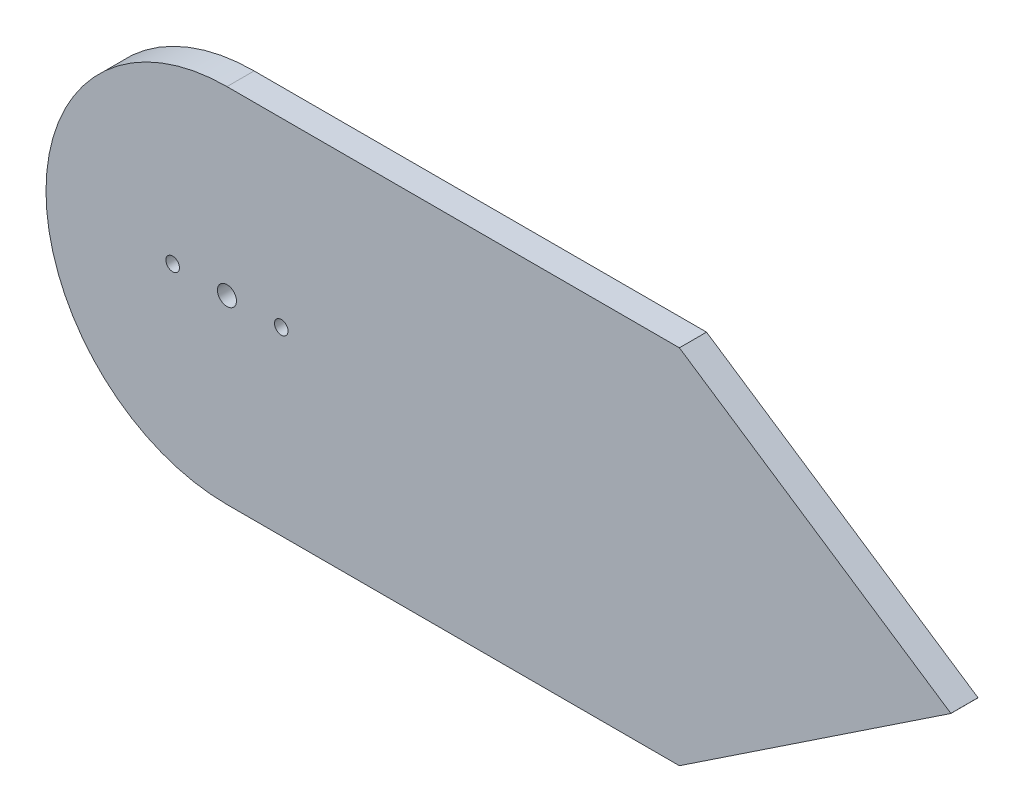
ISO-10303-21;
HEADER;
FILE_DESCRIPTION(('STEP AP214'),'2;1');
FILE_NAME('part.step','',(''),(''),'','','');
FILE_SCHEMA(('AUTOMOTIVE_DESIGN { 1 0 10303 214 1 1 1 1 }'));
ENDSEC;
DATA;
#1=APPLICATION_CONTEXT('core data for automotive mechanical design processes');
#2=APPLICATION_PROTOCOL_DEFINITION('international standard','automotive_design',2000,#1);
#3=PRODUCT_CONTEXT('',#1,'mechanical');
#4=PRODUCT('Part','Part','',(#3));
#5=PRODUCT_RELATED_PRODUCT_CATEGORY('part','',(#4));
#6=PRODUCT_DEFINITION_FORMATION('','',#4);
#7=PRODUCT_DEFINITION_CONTEXT('part definition',#1,'design');
#8=PRODUCT_DEFINITION('design','',#6,#7);
#9=PRODUCT_DEFINITION_SHAPE('','',#8);
#10=(LENGTH_UNIT() NAMED_UNIT(*) SI_UNIT(.MILLI.,.METRE.));
#11=(NAMED_UNIT(*) PLANE_ANGLE_UNIT() SI_UNIT($,.RADIAN.));
#12=(NAMED_UNIT(*) SI_UNIT($,.STERADIAN.) SOLID_ANGLE_UNIT());
#13=UNCERTAINTY_MEASURE_WITH_UNIT(LENGTH_MEASURE(1.E-05),#10,'distance_accuracy_value','');
#14=(GEOMETRIC_REPRESENTATION_CONTEXT(3) GLOBAL_UNCERTAINTY_ASSIGNED_CONTEXT((#13)) GLOBAL_UNIT_ASSIGNED_CONTEXT((#10,
#11,#12)) REPRESENTATION_CONTEXT('',''));
#15=CARTESIAN_POINT('',(0.,0.,0.));
#16=DIRECTION('',(0.,0.,1.));
#17=DIRECTION('',(1.,0.,0.));
#18=AXIS2_PLACEMENT_3D('',#15,#16,#17);
#19=CARTESIAN_POINT('',(0.,0.,0.));
#20=DIRECTION('',(0.,0.,-1.));
#21=DIRECTION('',(0.,1.,0.));
#22=AXIS2_PLACEMENT_3D('',#19,#20,#21);
#23=CYLINDRICAL_SURFACE('',#22,20.);
#24=CARTESIAN_POINT('',(0.,0.,-3.));
#25=DIRECTION('',(0.,0.,1.));
#26=DIRECTION('',(0.,-1.,0.));
#27=AXIS2_PLACEMENT_3D('',#24,#25,#26);
#28=CIRCLE('',#27,20.);
#29=CARTESIAN_POINT('',(0.,20.,-2.99999999999993));
#30=VERTEX_POINT('',#29);
#31=CARTESIAN_POINT('',(0.,-20.,-3.00000000000007));
#32=VERTEX_POINT('',#31);
#33=EDGE_CURVE('E118',#30,#32,#28,.T.);
#34=ORIENTED_EDGE('',*,*,#33,.T.);
#35=DIRECTION('',(0.,0.,-1.));
#36=VECTOR('',#35,1.);
#37=CARTESIAN_POINT('',(0.,-20.,0.));
#38=LINE('',#37,#36);
#39=CARTESIAN_POINT('',(0.,-20.,0.));
#40=VERTEX_POINT('',#39);
#41=EDGE_CURVE('E11',#40,#32,#38,.T.);
#42=ORIENTED_EDGE('',*,*,#41,.F.);
#43=CARTESIAN_POINT('',(0.,0.,0.));
#44=DIRECTION('',(0.,0.,1.));
#45=DIRECTION('',(0.,-1.,0.));
#46=AXIS2_PLACEMENT_3D('',#43,#44,#45);
#47=CIRCLE('',#46,20.);
#48=CARTESIAN_POINT('',(0.,20.,0.));
#49=VERTEX_POINT('',#48);
#50=EDGE_CURVE('E83',#49,#40,#47,.T.);
#51=ORIENTED_EDGE('',*,*,#50,.F.);
#52=DIRECTION('',(0.,0.,-1.));
#53=VECTOR('',#52,1.);
#54=CARTESIAN_POINT('',(0.,20.,0.));
#55=LINE('',#54,#53);
#56=EDGE_CURVE('E52',#49,#30,#55,.T.);
#57=ORIENTED_EDGE('',*,*,#56,.T.);
#58=EDGE_LOOP('',(#34,#42,#51,#57));
#59=FACE_BOUND('',#58,.T.);
#60=ADVANCED_FACE('F36',(#59),#23,.T.);
#61=CARTESIAN_POINT('',(50.,-20.,0.));
#62=DIRECTION('',(0.,-1.,0.));
#63=DIRECTION('',(1.,0.,0.));
#64=AXIS2_PLACEMENT_3D('',#61,#62,#63);
#65=PLANE('',#64);
#66=DIRECTION('',(-1.,0.,0.));
#67=VECTOR('',#66,1.);
#68=CARTESIAN_POINT('',(50.,-20.,-3.00000000000007));
#69=LINE('',#68,#67);
#70=CARTESIAN_POINT('',(50.,-20.,-3.00000000000007));
#71=VERTEX_POINT('',#70);
#72=EDGE_CURVE('E120',#71,#32,#69,.T.);
#73=ORIENTED_EDGE('',*,*,#72,.F.);
#74=DIRECTION('',(0.,0.,-1.));
#75=VECTOR('',#74,1.);
#76=CARTESIAN_POINT('',(50.,-20.,0.));
#77=LINE('',#76,#75);
#78=CARTESIAN_POINT('',(50.,-20.,0.));
#79=VERTEX_POINT('',#78);
#80=EDGE_CURVE('E44',#79,#71,#77,.T.);
#81=ORIENTED_EDGE('',*,*,#80,.F.);
#82=DIRECTION('',(-1.,0.,0.));
#83=VECTOR('',#82,1.);
#84=CARTESIAN_POINT('',(50.,-20.,0.));
#85=LINE('',#84,#83);
#86=EDGE_CURVE('E159',#79,#40,#85,.T.);
#87=ORIENTED_EDGE('',*,*,#86,.T.);
#88=ORIENTED_EDGE('',*,*,#41,.T.);
#89=EDGE_LOOP('',(#73,#81,#87,#88));
#90=FACE_BOUND('',#89,.T.);
#91=ADVANCED_FACE('F141',(#90),#65,.T.);
#92=CARTESIAN_POINT('',(80.,0.,0.));
#93=DIRECTION('',(0.554700196225229,-0.832050294337844,0.));
#94=DIRECTION('',(0.832050294337844,0.554700196225229,0.));
#95=AXIS2_PLACEMENT_3D('',#92,#93,#94);
#96=PLANE('',#95);
#97=DIRECTION('',(-0.832050294337844,-0.554700196225229,0.));
#98=VECTOR('',#97,1.);
#99=CARTESIAN_POINT('',(80.,0.,-3.));
#100=LINE('',#99,#98);
#101=CARTESIAN_POINT('',(80.,0.,-3.));
#102=VERTEX_POINT('',#101);
#103=EDGE_CURVE('E124',#102,#71,#100,.T.);
#104=ORIENTED_EDGE('',*,*,#103,.F.);
#105=DIRECTION('',(0.,0.,-1.));
#106=VECTOR('',#105,1.);
#107=CARTESIAN_POINT('',(80.,0.,0.));
#108=LINE('',#107,#106);
#109=CARTESIAN_POINT('',(80.,0.,0.));
#110=VERTEX_POINT('',#109);
#111=EDGE_CURVE('E110',#110,#102,#108,.T.);
#112=ORIENTED_EDGE('',*,*,#111,.F.);
#113=DIRECTION('',(-0.832050294337844,-0.554700196225229,0.));
#114=VECTOR('',#113,1.);
#115=CARTESIAN_POINT('',(80.,0.,0.));
#116=LINE('',#115,#114);
#117=EDGE_CURVE('E100',#110,#79,#116,.T.);
#118=ORIENTED_EDGE('',*,*,#117,.T.);
#119=ORIENTED_EDGE('',*,*,#80,.T.);
#120=EDGE_LOOP('',(#104,#112,#118,#119));
#121=FACE_BOUND('',#120,.T.);
#122=ADVANCED_FACE('F138',(#121),#96,.T.);
#123=CARTESIAN_POINT('',(80.,0.,0.));
#124=DIRECTION('',(-1.,0.,0.));
#125=DIRECTION('',(0.,-1.,0.));
#126=AXIS2_PLACEMENT_3D('',#123,#124,#125);
#127=PLANE('',#126);
#128=DIRECTION('',(0.,1.,0.));
#129=VECTOR('',#128,1.);
#130=CARTESIAN_POINT('',(80.,0.,-3.));
#131=LINE('',#130,#129);
#132=CARTESIAN_POINT('',(80.,0.010830805194928,-3.));
#133=VERTEX_POINT('',#132);
#134=EDGE_CURVE('E107',#102,#133,#131,.T.);
#135=ORIENTED_EDGE('',*,*,#134,.T.);
#136=DIRECTION('',(0.,0.,-1.));
#137=VECTOR('',#136,1.);
#138=CARTESIAN_POINT('',(80.,0.0108308051949175,0.));
#139=LINE('',#138,#137);
#140=CARTESIAN_POINT('',(80.,0.0108308051949175,0.));
#141=VERTEX_POINT('',#140);
#142=EDGE_CURVE('E104',#141,#133,#139,.T.);
#143=ORIENTED_EDGE('',*,*,#142,.F.);
#144=DIRECTION('',(0.,1.,0.));
#145=VECTOR('',#144,1.);
#146=CARTESIAN_POINT('',(80.,0.,0.));
#147=LINE('',#146,#145);
#148=EDGE_CURVE('E94',#110,#141,#147,.T.);
#149=ORIENTED_EDGE('',*,*,#148,.F.);
#150=ORIENTED_EDGE('',*,*,#111,.T.);
#151=EDGE_LOOP('',(#135,#143,#149,#150));
#152=FACE_BOUND('',#151,.T.);
#153=ADVANCED_FACE('F105',(#152),#127,.F.);
#154=CARTESIAN_POINT('',(50.,20.,0.));
#155=DIRECTION('',(0.554492180210911,0.832188934127912,0.));
#156=DIRECTION('',(-0.832188934127912,0.554492180210911,0.));
#157=AXIS2_PLACEMENT_3D('',#154,#155,#156);
#158=PLANE('',#157);
#159=DIRECTION('',(0.832188934127912,-0.554492180210911,0.));
#160=VECTOR('',#159,1.);
#161=CARTESIAN_POINT('',(50.,20.,-2.99999999999993));
#162=LINE('',#161,#160);
#163=CARTESIAN_POINT('',(50.,20.,-2.99999999999993));
#164=VERTEX_POINT('',#163);
#165=EDGE_CURVE('E128',#164,#133,#162,.T.);
#166=ORIENTED_EDGE('',*,*,#165,.F.);
#167=DIRECTION('',(0.,0.,-1.));
#168=VECTOR('',#167,1.);
#169=CARTESIAN_POINT('',(50.,20.,0.));
#170=LINE('',#169,#168);
#171=CARTESIAN_POINT('',(50.,20.,0.));
#172=VERTEX_POINT('',#171);
#173=EDGE_CURVE('E71',#172,#164,#170,.T.);
#174=ORIENTED_EDGE('',*,*,#173,.F.);
#175=DIRECTION('',(0.832188934127912,-0.554492180210911,0.));
#176=VECTOR('',#175,1.);
#177=CARTESIAN_POINT('',(50.,20.,0.));
#178=LINE('',#177,#176);
#179=EDGE_CURVE('E98',#172,#141,#178,.T.);
#180=ORIENTED_EDGE('',*,*,#179,.T.);
#181=ORIENTED_EDGE('',*,*,#142,.T.);
#182=EDGE_LOOP('',(#166,#174,#180,#181));
#183=FACE_BOUND('',#182,.T.);
#184=ADVANCED_FACE('F112',(#183),#158,.T.);
#185=CARTESIAN_POINT('',(0.,20.,0.));
#186=DIRECTION('',(0.,1.,0.));
#187=DIRECTION('',(-1.,0.,0.));
#188=AXIS2_PLACEMENT_3D('',#185,#186,#187);
#189=PLANE('',#188);
#190=DIRECTION('',(1.,0.,0.));
#191=VECTOR('',#190,1.);
#192=CARTESIAN_POINT('',(0.,20.,-2.99999999999993));
#193=LINE('',#192,#191);
#194=EDGE_CURVE('E130',#30,#164,#193,.T.);
#195=ORIENTED_EDGE('',*,*,#194,.F.);
#196=ORIENTED_EDGE('',*,*,#56,.F.);
#197=DIRECTION('',(1.,0.,0.));
#198=VECTOR('',#197,1.);
#199=CARTESIAN_POINT('',(0.,20.,0.));
#200=LINE('',#199,#198);
#201=EDGE_CURVE('E113',#49,#172,#200,.T.);
#202=ORIENTED_EDGE('',*,*,#201,.T.);
#203=ORIENTED_EDGE('',*,*,#173,.T.);
#204=EDGE_LOOP('',(#195,#196,#202,#203));
#205=FACE_BOUND('',#204,.T.);
#206=ADVANCED_FACE('F144',(#205),#189,.T.);
#207=CARTESIAN_POINT('',(0.,0.,0.));
#208=DIRECTION('',(0.,0.,1.));
#209=DIRECTION('',(0.,-1.,0.));
#210=AXIS2_PLACEMENT_3D('',#207,#208,#209);
#211=PLANE('',#210);
#212=CARTESIAN_POINT('',(6.,-0.0325899433543097,0.));
#213=DIRECTION('',(0.,0.,1.));
#214=DIRECTION('',(1.,0.,0.));
#215=AXIS2_PLACEMENT_3D('',#212,#213,#214);
#216=CIRCLE('',#215,0.749999999999998);
#217=CARTESIAN_POINT('',(6.75,-0.0325899433543097,0.));
#218=VERTEX_POINT('',#217);
#219=EDGE_CURVE('E169',#218,#218,#216,.T.);
#220=ORIENTED_EDGE('',*,*,#219,.F.);
#221=EDGE_LOOP('',(#220));
#222=FACE_BOUND('',#221,.T.);
#223=CARTESIAN_POINT('',(-5.99993497284714,0.0279342371608363,0.));
#224=DIRECTION('',(0.,0.,1.));
#225=DIRECTION('',(1.,0.,0.));
#226=AXIS2_PLACEMENT_3D('',#223,#224,#225);
#227=CIRCLE('',#226,0.749999999999999);
#228=CARTESIAN_POINT('',(-5.24993497284714,0.0279342371608363,0.));
#229=VERTEX_POINT('',#228);
#230=EDGE_CURVE('E168',#229,#229,#227,.T.);
#231=ORIENTED_EDGE('',*,*,#230,.F.);
#232=EDGE_LOOP('',(#231));
#233=FACE_BOUND('',#232,.T.);
#234=CARTESIAN_POINT('',(0.,0.,0.));
#235=DIRECTION('',(0.,0.,1.));
#236=DIRECTION('',(1.,0.,0.));
#237=AXIS2_PLACEMENT_3D('',#234,#235,#236);
#238=CIRCLE('',#237,1.05);
#239=CARTESIAN_POINT('',(1.05,0.,0.));
#240=VERTEX_POINT('',#239);
#241=EDGE_CURVE('E165',#240,#240,#238,.T.);
#242=ORIENTED_EDGE('',*,*,#241,.F.);
#243=EDGE_LOOP('',(#242));
#244=FACE_BOUND('',#243,.T.);
#245=ORIENTED_EDGE('',*,*,#50,.T.);
#246=ORIENTED_EDGE('',*,*,#86,.F.);
#247=ORIENTED_EDGE('',*,*,#117,.F.);
#248=ORIENTED_EDGE('',*,*,#148,.T.);
#249=ORIENTED_EDGE('',*,*,#179,.F.);
#250=ORIENTED_EDGE('',*,*,#201,.F.);
#251=EDGE_LOOP('',(#245,#246,#247,#248,#249,#250));
#252=FACE_BOUND('',#251,.T.);
#253=ADVANCED_FACE('F96',(#222,#233,#244,#252),#211,.T.);
#254=CARTESIAN_POINT('',(0.,0.,-3.));
#255=DIRECTION('',(0.,0.,1.));
#256=DIRECTION('',(0.,-1.,0.));
#257=AXIS2_PLACEMENT_3D('',#254,#255,#256);
#258=PLANE('',#257);
#259=CARTESIAN_POINT('',(6.,-0.0325899433543097,-3.));
#260=DIRECTION('',(0.,0.,1.));
#261=DIRECTION('',(0.,-1.,0.));
#262=AXIS2_PLACEMENT_3D('',#259,#260,#261);
#263=CIRCLE('',#262,0.749999999999998);
#264=CARTESIAN_POINT('',(6.,-0.782589943354308,-3.));
#265=VERTEX_POINT('',#264);
#266=EDGE_CURVE('E173',#265,#265,#263,.F.);
#267=ORIENTED_EDGE('',*,*,#266,.F.);
#268=EDGE_LOOP('',(#267));
#269=FACE_BOUND('',#268,.T.);
#270=CARTESIAN_POINT('',(-5.99993497284714,0.0279342371608363,-3.));
#271=DIRECTION('',(0.,0.,1.));
#272=DIRECTION('',(0.,-1.,0.));
#273=AXIS2_PLACEMENT_3D('',#270,#271,#272);
#274=CIRCLE('',#273,0.749999999999999);
#275=CARTESIAN_POINT('',(-5.99993497284714,-0.722065762839163,-3.));
#276=VERTEX_POINT('',#275);
#277=EDGE_CURVE('E172',#276,#276,#274,.F.);
#278=ORIENTED_EDGE('',*,*,#277,.F.);
#279=EDGE_LOOP('',(#278));
#280=FACE_BOUND('',#279,.T.);
#281=CARTESIAN_POINT('',(0.,0.,-3.));
#282=DIRECTION('',(0.,0.,1.));
#283=DIRECTION('',(0.,-1.,0.));
#284=AXIS2_PLACEMENT_3D('',#281,#282,#283);
#285=CIRCLE('',#284,1.05);
#286=CARTESIAN_POINT('',(0.,-1.05,-3.));
#287=VERTEX_POINT('',#286);
#288=EDGE_CURVE('E121',#287,#287,#285,.F.);
#289=ORIENTED_EDGE('',*,*,#288,.F.);
#290=EDGE_LOOP('',(#289));
#291=FACE_BOUND('',#290,.T.);
#292=ORIENTED_EDGE('',*,*,#33,.F.);
#293=ORIENTED_EDGE('',*,*,#194,.T.);
#294=ORIENTED_EDGE('',*,*,#165,.T.);
#295=ORIENTED_EDGE('',*,*,#134,.F.);
#296=ORIENTED_EDGE('',*,*,#103,.T.);
#297=ORIENTED_EDGE('',*,*,#72,.T.);
#298=EDGE_LOOP('',(#292,#293,#294,#295,#296,#297));
#299=FACE_BOUND('',#298,.T.);
#300=ADVANCED_FACE('F143',(#269,#280,#291,#299),#258,.F.);
#301=CARTESIAN_POINT('',(0.,0.,-3.00100000000007));
#302=DIRECTION('',(0.,0.,1.));
#303=DIRECTION('',(1.,0.,0.));
#304=AXIS2_PLACEMENT_3D('',#301,#302,#303);
#305=CYLINDRICAL_SURFACE('',#304,1.05);
#306=ORIENTED_EDGE('',*,*,#241,.T.);
#307=EDGE_LOOP('',(#306));
#308=FACE_BOUND('',#307,.T.);
#309=ORIENTED_EDGE('',*,*,#288,.T.);
#310=EDGE_LOOP('',(#309));
#311=FACE_BOUND('',#310,.T.);
#312=ADVANCED_FACE('F185',(#308,#311),#305,.F.);
#313=CARTESIAN_POINT('',(-5.99993497284714,0.0279342371608363,-3.00100000000007));
#314=DIRECTION('',(0.,0.,1.));
#315=DIRECTION('',(1.,0.,0.));
#316=AXIS2_PLACEMENT_3D('',#313,#314,#315);
#317=CYLINDRICAL_SURFACE('',#316,0.749999999999999);
#318=ORIENTED_EDGE('',*,*,#230,.T.);
#319=EDGE_LOOP('',(#318));
#320=FACE_BOUND('',#319,.T.);
#321=ORIENTED_EDGE('',*,*,#277,.T.);
#322=EDGE_LOOP('',(#321));
#323=FACE_BOUND('',#322,.T.);
#324=ADVANCED_FACE('F181',(#320,#323),#317,.F.);
#325=CARTESIAN_POINT('',(6.,-0.0325899433543097,-3.00100000000007));
#326=DIRECTION('',(0.,0.,1.));
#327=DIRECTION('',(1.,0.,0.));
#328=AXIS2_PLACEMENT_3D('',#325,#326,#327);
#329=CYLINDRICAL_SURFACE('',#328,0.749999999999998);
#330=ORIENTED_EDGE('',*,*,#219,.T.);
#331=EDGE_LOOP('',(#330));
#332=FACE_BOUND('',#331,.T.);
#333=ORIENTED_EDGE('',*,*,#266,.T.);
#334=EDGE_LOOP('',(#333));
#335=FACE_BOUND('',#334,.T.);
#336=ADVANCED_FACE('F195',(#332,#335),#329,.F.);
#337=CLOSED_SHELL('',(#60,#91,#122,#153,#184,#206,#253,#300,#312,#324,#336));
#338=MANIFOLD_SOLID_BREP('B2',#337);
#339=ADVANCED_BREP_SHAPE_REPRESENTATION('',(#18,#338),#14);
#340=SHAPE_DEFINITION_REPRESENTATION(#9,#339);
ENDSEC;
END-ISO-10303-21;
